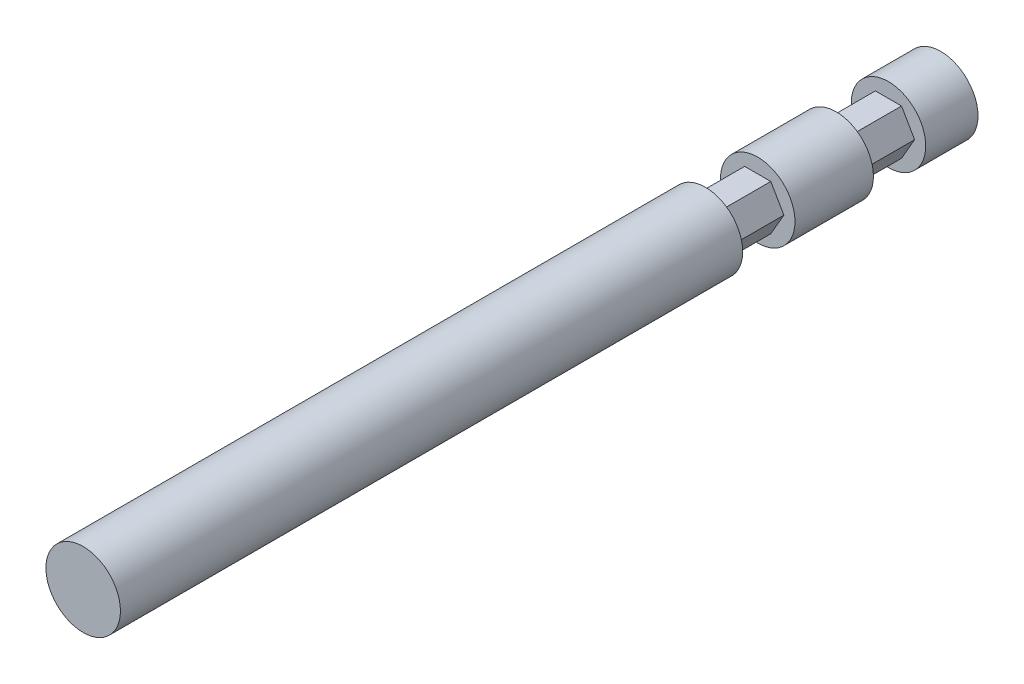
ISO-10303-21;
HEADER;
FILE_DESCRIPTION(('STEP AP214'),'2;1');
FILE_NAME('part.step','',(''),(''),'','','');
FILE_SCHEMA(('AUTOMOTIVE_DESIGN { 1 0 10303 214 1 1 1 1 }'));
ENDSEC;
DATA;
#1=APPLICATION_CONTEXT('core data for automotive mechanical design processes');
#2=APPLICATION_PROTOCOL_DEFINITION('international standard','automotive_design',2000,#1);
#3=PRODUCT_CONTEXT('',#1,'mechanical');
#4=PRODUCT('Part','Part','',(#3));
#5=PRODUCT_RELATED_PRODUCT_CATEGORY('part','',(#4));
#6=PRODUCT_DEFINITION_FORMATION('','',#4);
#7=PRODUCT_DEFINITION_CONTEXT('part definition',#1,'design');
#8=PRODUCT_DEFINITION('design','',#6,#7);
#9=PRODUCT_DEFINITION_SHAPE('','',#8);
#10=(LENGTH_UNIT() NAMED_UNIT(*) SI_UNIT(.MILLI.,.METRE.));
#11=(NAMED_UNIT(*) PLANE_ANGLE_UNIT() SI_UNIT($,.RADIAN.));
#12=(NAMED_UNIT(*) SI_UNIT($,.STERADIAN.) SOLID_ANGLE_UNIT());
#13=UNCERTAINTY_MEASURE_WITH_UNIT(LENGTH_MEASURE(1.E-05),#10,'distance_accuracy_value','');
#14=(GEOMETRIC_REPRESENTATION_CONTEXT(3) GLOBAL_UNCERTAINTY_ASSIGNED_CONTEXT((#13)) GLOBAL_UNIT_ASSIGNED_CONTEXT((#10,
#11,#12)) REPRESENTATION_CONTEXT('',''));
#15=CARTESIAN_POINT('',(0.,0.,0.));
#16=DIRECTION('',(0.,0.,1.));
#17=DIRECTION('',(1.,0.,0.));
#18=AXIS2_PLACEMENT_3D('',#15,#16,#17);
#19=CARTESIAN_POINT('',(0.,0.,4.));
#20=DIRECTION('',(0.,0.,-1.));
#21=DIRECTION('',(-1.,0.,0.));
#22=AXIS2_PLACEMENT_3D('',#19,#20,#21);
#23=CYLINDRICAL_SURFACE('',#22,2.85);
#24=CARTESIAN_POINT('',(0.,0.,4.));
#25=DIRECTION('',(0.,0.,1.));
#26=DIRECTION('',(1.,0.,0.));
#27=AXIS2_PLACEMENT_3D('',#24,#25,#26);
#28=CIRCLE('',#27,2.85);
#29=CARTESIAN_POINT('',(2.85,0.,4.));
#30=VERTEX_POINT('',#29);
#31=EDGE_CURVE('E11',#30,#30,#28,.T.);
#32=ORIENTED_EDGE('',*,*,#31,.F.);
#33=EDGE_LOOP('',(#32));
#34=FACE_BOUND('',#33,.T.);
#35=CARTESIAN_POINT('',(0.,0.,0.));
#36=DIRECTION('',(0.,0.,1.));
#37=DIRECTION('',(1.,0.,0.));
#38=AXIS2_PLACEMENT_3D('',#35,#36,#37);
#39=CIRCLE('',#38,2.85);
#40=CARTESIAN_POINT('',(2.85,0.,0.));
#41=VERTEX_POINT('',#40);
#42=EDGE_CURVE('E42',#41,#41,#39,.T.);
#43=ORIENTED_EDGE('',*,*,#42,.T.);
#44=EDGE_LOOP('',(#43));
#45=FACE_BOUND('',#44,.T.);
#46=ADVANCED_FACE('F39',(#34,#45),#23,.T.);
#47=CARTESIAN_POINT('',(0.,0.,4.));
#48=DIRECTION('',(0.,0.,1.));
#49=DIRECTION('',(1.,0.,0.));
#50=AXIS2_PLACEMENT_3D('',#47,#48,#49);
#51=PLANE('',#50);
#52=DIRECTION('',(0.5,0.866025403784439,0.));
#53=VECTOR('',#52,1.);
#54=CARTESIAN_POINT('',(1.,-1.73205080756888,4.));
#55=LINE('',#54,#53);
#56=CARTESIAN_POINT('',(1.,-1.73205080756888,4.));
#57=VERTEX_POINT('',#56);
#58=CARTESIAN_POINT('',(2.,0.,4.));
#59=VERTEX_POINT('',#58);
#60=EDGE_CURVE('E200',#57,#59,#55,.T.);
#61=ORIENTED_EDGE('',*,*,#60,.F.);
#62=DIRECTION('',(1.,0.,0.));
#63=VECTOR('',#62,1.);
#64=CARTESIAN_POINT('',(-1.,-1.73205080756888,4.));
#65=LINE('',#64,#63);
#66=CARTESIAN_POINT('',(-1.,-1.73205080756888,4.));
#67=VERTEX_POINT('',#66);
#68=EDGE_CURVE('E209',#67,#57,#65,.T.);
#69=ORIENTED_EDGE('',*,*,#68,.F.);
#70=DIRECTION('',(0.5,-0.866025403784439,0.));
#71=VECTOR('',#70,1.);
#72=CARTESIAN_POINT('',(-2.,0.,4.));
#73=LINE('',#72,#71);
#74=CARTESIAN_POINT('',(-2.,0.,4.));
#75=VERTEX_POINT('',#74);
#76=EDGE_CURVE('E245',#75,#67,#73,.T.);
#77=ORIENTED_EDGE('',*,*,#76,.F.);
#78=DIRECTION('',(-0.5,-0.866025403784439,0.));
#79=VECTOR('',#78,1.);
#80=CARTESIAN_POINT('',(-1.,1.73205080756888,4.));
#81=LINE('',#80,#79);
#82=CARTESIAN_POINT('',(-1.,1.73205080756888,4.));
#83=VERTEX_POINT('',#82);
#84=EDGE_CURVE('E241',#83,#75,#81,.T.);
#85=ORIENTED_EDGE('',*,*,#84,.F.);
#86=DIRECTION('',(-1.,0.,0.));
#87=VECTOR('',#86,1.);
#88=CARTESIAN_POINT('',(1.,1.73205080756888,4.));
#89=LINE('',#88,#87);
#90=CARTESIAN_POINT('',(1.,1.73205080756888,4.));
#91=VERTEX_POINT('',#90);
#92=EDGE_CURVE('E237',#91,#83,#89,.T.);
#93=ORIENTED_EDGE('',*,*,#92,.F.);
#94=DIRECTION('',(-0.5,0.866025403784439,0.));
#95=VECTOR('',#94,1.);
#96=CARTESIAN_POINT('',(2.,0.,4.));
#97=LINE('',#96,#95);
#98=EDGE_CURVE('E233',#59,#91,#97,.T.);
#99=ORIENTED_EDGE('',*,*,#98,.F.);
#100=EDGE_LOOP('',(#61,#69,#77,#85,#93,#99));
#101=FACE_BOUND('',#100,.T.);
#102=ORIENTED_EDGE('',*,*,#31,.T.);
#103=EDGE_LOOP('',(#102));
#104=FACE_BOUND('',#103,.T.);
#105=ADVANCED_FACE('F284',(#101,#104),#51,.T.);
#106=CARTESIAN_POINT('',(0.,0.,0.));
#107=DIRECTION('',(0.,0.,1.));
#108=DIRECTION('',(1.,0.,0.));
#109=AXIS2_PLACEMENT_3D('',#106,#107,#108);
#110=PLANE('',#109);
#111=ORIENTED_EDGE('',*,*,#42,.F.);
#112=EDGE_LOOP('',(#111));
#113=FACE_BOUND('',#112,.T.);
#114=ADVANCED_FACE('F281',(#113),#110,.F.);
#115=CARTESIAN_POINT('',(1.,-1.73205080756888,8.));
#116=DIRECTION('',(-0.866025403784439,0.5,0.));
#117=DIRECTION('',(-0.5,-0.866025403784439,0.));
#118=AXIS2_PLACEMENT_3D('',#115,#116,#117);
#119=PLANE('',#118);
#120=ORIENTED_EDGE('',*,*,#60,.T.);
#121=DIRECTION('',(0.,0.,-1.));
#122=VECTOR('',#121,1.);
#123=CARTESIAN_POINT('',(2.,0.,8.));
#124=LINE('',#123,#122);
#125=CARTESIAN_POINT('',(2.,0.,8.));
#126=VERTEX_POINT('',#125);
#127=EDGE_CURVE('E271',#126,#59,#124,.T.);
#128=ORIENTED_EDGE('',*,*,#127,.F.);
#129=DIRECTION('',(0.5,0.866025403784439,0.));
#130=VECTOR('',#129,1.);
#131=CARTESIAN_POINT('',(1.,-1.73205080756888,8.));
#132=LINE('',#131,#130);
#133=CARTESIAN_POINT('',(1.,-1.73205080756888,8.));
#134=VERTEX_POINT('',#133);
#135=EDGE_CURVE('E204',#134,#126,#132,.T.);
#136=ORIENTED_EDGE('',*,*,#135,.F.);
#137=DIRECTION('',(0.,0.,-1.));
#138=VECTOR('',#137,1.);
#139=CARTESIAN_POINT('',(1.,-1.73205080756888,8.));
#140=LINE('',#139,#138);
#141=EDGE_CURVE('E229',#134,#57,#140,.T.);
#142=ORIENTED_EDGE('',*,*,#141,.T.);
#143=EDGE_LOOP('',(#120,#128,#136,#142));
#144=FACE_BOUND('',#143,.T.);
#145=ADVANCED_FACE('F283',(#144),#119,.F.);
#146=CARTESIAN_POINT('',(2.,0.,8.));
#147=DIRECTION('',(-0.866025403784439,-0.5,0.));
#148=DIRECTION('',(0.5,-0.866025403784439,0.));
#149=AXIS2_PLACEMENT_3D('',#146,#147,#148);
#150=PLANE('',#149);
#151=ORIENTED_EDGE('',*,*,#98,.T.);
#152=DIRECTION('',(0.,0.,-1.));
#153=VECTOR('',#152,1.);
#154=CARTESIAN_POINT('',(1.,1.73205080756888,8.));
#155=LINE('',#154,#153);
#156=CARTESIAN_POINT('',(1.,1.73205080756888,8.));
#157=VERTEX_POINT('',#156);
#158=EDGE_CURVE('E267',#157,#91,#155,.T.);
#159=ORIENTED_EDGE('',*,*,#158,.F.);
#160=DIRECTION('',(-0.5,0.866025403784439,0.));
#161=VECTOR('',#160,1.);
#162=CARTESIAN_POINT('',(2.,0.,8.));
#163=LINE('',#162,#161);
#164=EDGE_CURVE('E208',#126,#157,#163,.T.);
#165=ORIENTED_EDGE('',*,*,#164,.F.);
#166=ORIENTED_EDGE('',*,*,#127,.T.);
#167=EDGE_LOOP('',(#151,#159,#165,#166));
#168=FACE_BOUND('',#167,.T.);
#169=ADVANCED_FACE('F289',(#168),#150,.F.);
#170=CARTESIAN_POINT('',(1.,1.73205080756888,8.));
#171=DIRECTION('',(0.,-1.,0.));
#172=DIRECTION('',(1.,0.,0.));
#173=AXIS2_PLACEMENT_3D('',#170,#171,#172);
#174=PLANE('',#173);
#175=ORIENTED_EDGE('',*,*,#92,.T.);
#176=DIRECTION('',(0.,0.,-1.));
#177=VECTOR('',#176,1.);
#178=CARTESIAN_POINT('',(-1.,1.73205080756888,8.));
#179=LINE('',#178,#177);
#180=CARTESIAN_POINT('',(-1.,1.73205080756888,8.));
#181=VERTEX_POINT('',#180);
#182=EDGE_CURVE('E263',#181,#83,#179,.T.);
#183=ORIENTED_EDGE('',*,*,#182,.F.);
#184=DIRECTION('',(-1.,0.,0.));
#185=VECTOR('',#184,1.);
#186=CARTESIAN_POINT('',(1.,1.73205080756888,8.));
#187=LINE('',#186,#185);
#188=EDGE_CURVE('E213',#157,#181,#187,.T.);
#189=ORIENTED_EDGE('',*,*,#188,.F.);
#190=ORIENTED_EDGE('',*,*,#158,.T.);
#191=EDGE_LOOP('',(#175,#183,#189,#190));
#192=FACE_BOUND('',#191,.T.);
#193=ADVANCED_FACE('F321',(#192),#174,.F.);
#194=CARTESIAN_POINT('',(-1.,1.73205080756888,8.));
#195=DIRECTION('',(0.866025403784439,-0.5,0.));
#196=DIRECTION('',(0.5,0.866025403784439,0.));
#197=AXIS2_PLACEMENT_3D('',#194,#195,#196);
#198=PLANE('',#197);
#199=ORIENTED_EDGE('',*,*,#84,.T.);
#200=DIRECTION('',(0.,0.,-1.));
#201=VECTOR('',#200,1.);
#202=CARTESIAN_POINT('',(-2.,0.,8.));
#203=LINE('',#202,#201);
#204=CARTESIAN_POINT('',(-2.,0.,8.));
#205=VERTEX_POINT('',#204);
#206=EDGE_CURVE('E259',#205,#75,#203,.T.);
#207=ORIENTED_EDGE('',*,*,#206,.F.);
#208=DIRECTION('',(-0.5,-0.866025403784439,0.));
#209=VECTOR('',#208,1.);
#210=CARTESIAN_POINT('',(-1.,1.73205080756888,8.));
#211=LINE('',#210,#209);
#212=EDGE_CURVE('E217',#181,#205,#211,.T.);
#213=ORIENTED_EDGE('',*,*,#212,.F.);
#214=ORIENTED_EDGE('',*,*,#182,.T.);
#215=EDGE_LOOP('',(#199,#207,#213,#214));
#216=FACE_BOUND('',#215,.T.);
#217=ADVANCED_FACE('F330',(#216),#198,.F.);
#218=CARTESIAN_POINT('',(-2.,0.,8.));
#219=DIRECTION('',(0.866025403784439,0.5,0.));
#220=DIRECTION('',(-0.5,0.866025403784439,0.));
#221=AXIS2_PLACEMENT_3D('',#218,#219,#220);
#222=PLANE('',#221);
#223=ORIENTED_EDGE('',*,*,#76,.T.);
#224=DIRECTION('',(0.,0.,-1.));
#225=VECTOR('',#224,1.);
#226=CARTESIAN_POINT('',(-1.,-1.73205080756888,8.));
#227=LINE('',#226,#225);
#228=CARTESIAN_POINT('',(-1.,-1.73205080756888,8.));
#229=VERTEX_POINT('',#228);
#230=EDGE_CURVE('E255',#229,#67,#227,.T.);
#231=ORIENTED_EDGE('',*,*,#230,.F.);
#232=DIRECTION('',(0.5,-0.866025403784439,0.));
#233=VECTOR('',#232,1.);
#234=CARTESIAN_POINT('',(-2.,0.,8.));
#235=LINE('',#234,#233);
#236=EDGE_CURVE('E221',#205,#229,#235,.T.);
#237=ORIENTED_EDGE('',*,*,#236,.F.);
#238=ORIENTED_EDGE('',*,*,#206,.T.);
#239=EDGE_LOOP('',(#223,#231,#237,#238));
#240=FACE_BOUND('',#239,.T.);
#241=ADVANCED_FACE('F340',(#240),#222,.F.);
#242=CARTESIAN_POINT('',(-1.,-1.73205080756888,8.));
#243=DIRECTION('',(0.,1.,0.));
#244=DIRECTION('',(-1.,0.,0.));
#245=AXIS2_PLACEMENT_3D('',#242,#243,#244);
#246=PLANE('',#245);
#247=ORIENTED_EDGE('',*,*,#68,.T.);
#248=ORIENTED_EDGE('',*,*,#141,.F.);
#249=DIRECTION('',(1.,0.,0.));
#250=VECTOR('',#249,1.);
#251=CARTESIAN_POINT('',(-1.,-1.73205080756888,8.));
#252=LINE('',#251,#250);
#253=EDGE_CURVE('E225',#229,#134,#252,.T.);
#254=ORIENTED_EDGE('',*,*,#253,.F.);
#255=ORIENTED_EDGE('',*,*,#230,.T.);
#256=EDGE_LOOP('',(#247,#248,#254,#255));
#257=FACE_BOUND('',#256,.T.);
#258=ADVANCED_FACE('F350',(#257),#246,.F.);
#259=CARTESIAN_POINT('',(0.,0.,8.));
#260=DIRECTION('',(0.,0.,1.));
#261=DIRECTION('',(1.,0.,0.));
#262=AXIS2_PLACEMENT_3D('',#259,#260,#261);
#263=PLANE('',#262);
#264=CARTESIAN_POINT('',(0.,0.,8.));
#265=DIRECTION('',(0.,0.,1.));
#266=DIRECTION('',(1.,0.,0.));
#267=AXIS2_PLACEMENT_3D('',#264,#265,#266);
#268=CIRCLE('',#267,2.85);
#269=CARTESIAN_POINT('',(2.85,0.,8.));
#270=VERTEX_POINT('',#269);
#271=EDGE_CURVE('E195',#270,#270,#268,.T.);
#272=ORIENTED_EDGE('',*,*,#271,.F.);
#273=EDGE_LOOP('',(#272));
#274=FACE_BOUND('',#273,.T.);
#275=ORIENTED_EDGE('',*,*,#253,.T.);
#276=ORIENTED_EDGE('',*,*,#135,.T.);
#277=ORIENTED_EDGE('',*,*,#164,.T.);
#278=ORIENTED_EDGE('',*,*,#188,.T.);
#279=ORIENTED_EDGE('',*,*,#212,.T.);
#280=ORIENTED_EDGE('',*,*,#236,.T.);
#281=EDGE_LOOP('',(#275,#276,#277,#278,#279,#280));
#282=FACE_BOUND('',#281,.T.);
#283=ADVANCED_FACE('F360',(#274,#282),#263,.F.);
#284=CARTESIAN_POINT('',(0.,0.,14.));
#285=DIRECTION('',(0.,0.,-1.));
#286=DIRECTION('',(-1.,0.,0.));
#287=AXIS2_PLACEMENT_3D('',#284,#285,#286);
#288=CYLINDRICAL_SURFACE('',#287,2.85);
#289=CARTESIAN_POINT('',(0.,0.,14.));
#290=DIRECTION('',(0.,0.,1.));
#291=DIRECTION('',(1.,0.,0.));
#292=AXIS2_PLACEMENT_3D('',#289,#290,#291);
#293=CIRCLE('',#292,2.85);
#294=CARTESIAN_POINT('',(2.85,0.,14.));
#295=VERTEX_POINT('',#294);
#296=EDGE_CURVE('E196',#295,#295,#293,.T.);
#297=ORIENTED_EDGE('',*,*,#296,.F.);
#298=EDGE_LOOP('',(#297));
#299=FACE_BOUND('',#298,.T.);
#300=ORIENTED_EDGE('',*,*,#271,.T.);
#301=EDGE_LOOP('',(#300));
#302=FACE_BOUND('',#301,.T.);
#303=ADVANCED_FACE('F370',(#299,#302),#288,.T.);
#304=CARTESIAN_POINT('',(0.,0.,14.));
#305=DIRECTION('',(0.,0.,1.));
#306=DIRECTION('',(1.,0.,0.));
#307=AXIS2_PLACEMENT_3D('',#304,#305,#306);
#308=PLANE('',#307);
#309=DIRECTION('',(0.5,0.866025403784439,0.));
#310=VECTOR('',#309,1.);
#311=CARTESIAN_POINT('',(1.,-1.73205080756888,14.));
#312=LINE('',#311,#310);
#313=CARTESIAN_POINT('',(1.,-1.73205080756888,14.));
#314=VERTEX_POINT('',#313);
#315=CARTESIAN_POINT('',(2.,0.,14.));
#316=VERTEX_POINT('',#315);
#317=EDGE_CURVE('E54',#314,#316,#312,.T.);
#318=ORIENTED_EDGE('',*,*,#317,.F.);
#319=DIRECTION('',(1.,0.,0.));
#320=VECTOR('',#319,1.);
#321=CARTESIAN_POINT('',(-1.,-1.73205080756888,14.));
#322=LINE('',#321,#320);
#323=CARTESIAN_POINT('',(-1.,-1.73205080756888,14.));
#324=VERTEX_POINT('',#323);
#325=EDGE_CURVE('E58',#324,#314,#322,.T.);
#326=ORIENTED_EDGE('',*,*,#325,.F.);
#327=DIRECTION('',(0.5,-0.866025403784439,0.));
#328=VECTOR('',#327,1.);
#329=CARTESIAN_POINT('',(-2.,0.,14.));
#330=LINE('',#329,#328);
#331=CARTESIAN_POINT('',(-2.,0.,14.));
#332=VERTEX_POINT('',#331);
#333=EDGE_CURVE('E174',#332,#324,#330,.T.);
#334=ORIENTED_EDGE('',*,*,#333,.F.);
#335=DIRECTION('',(-0.5,-0.866025403784438,0.));
#336=VECTOR('',#335,1.);
#337=CARTESIAN_POINT('',(-0.999999999999999,1.73205080756888,14.));
#338=LINE('',#337,#336);
#339=CARTESIAN_POINT('',(-0.999999999999999,1.73205080756888,14.));
#340=VERTEX_POINT('',#339);
#341=EDGE_CURVE('E170',#340,#332,#338,.T.);
#342=ORIENTED_EDGE('',*,*,#341,.F.);
#343=DIRECTION('',(-1.,0.,0.));
#344=VECTOR('',#343,1.);
#345=CARTESIAN_POINT('',(1.,1.73205080756888,14.));
#346=LINE('',#345,#344);
#347=CARTESIAN_POINT('',(1.,1.73205080756888,14.));
#348=VERTEX_POINT('',#347);
#349=EDGE_CURVE('E166',#348,#340,#346,.T.);
#350=ORIENTED_EDGE('',*,*,#349,.F.);
#351=DIRECTION('',(-0.5,0.866025403784439,0.));
#352=VECTOR('',#351,1.);
#353=CARTESIAN_POINT('',(2.,0.,14.));
#354=LINE('',#353,#352);
#355=EDGE_CURVE('E161',#316,#348,#354,.T.);
#356=ORIENTED_EDGE('',*,*,#355,.F.);
#357=EDGE_LOOP('',(#318,#326,#334,#342,#350,#356));
#358=FACE_BOUND('',#357,.T.);
#359=ORIENTED_EDGE('',*,*,#296,.T.);
#360=EDGE_LOOP('',(#359));
#361=FACE_BOUND('',#360,.T.);
#362=ADVANCED_FACE('F380',(#358,#361),#308,.T.);
#363=CARTESIAN_POINT('',(1.,-1.73205080756888,18.));
#364=DIRECTION('',(-0.866025403784439,0.5,0.));
#365=DIRECTION('',(-0.5,-0.866025403784439,0.));
#366=AXIS2_PLACEMENT_3D('',#363,#364,#365);
#367=PLANE('',#366);
#368=ORIENTED_EDGE('',*,*,#317,.T.);
#369=DIRECTION('',(0.,0.,-1.));
#370=VECTOR('',#369,1.);
#371=CARTESIAN_POINT('',(2.,0.,18.));
#372=LINE('',#371,#370);
#373=CARTESIAN_POINT('',(2.,0.,18.));
#374=VERTEX_POINT('',#373);
#375=EDGE_CURVE('E132',#374,#316,#372,.T.);
#376=ORIENTED_EDGE('',*,*,#375,.F.);
#377=DIRECTION('',(0.5,0.866025403784439,0.));
#378=VECTOR('',#377,1.);
#379=CARTESIAN_POINT('',(1.,-1.73205080756888,18.));
#380=LINE('',#379,#378);
#381=CARTESIAN_POINT('',(1.,-1.73205080756888,18.));
#382=VERTEX_POINT('',#381);
#383=EDGE_CURVE('E127',#382,#374,#380,.T.);
#384=ORIENTED_EDGE('',*,*,#383,.F.);
#385=DIRECTION('',(0.,0.,-1.));
#386=VECTOR('',#385,1.);
#387=CARTESIAN_POINT('',(1.,-1.73205080756888,18.));
#388=LINE('',#387,#386);
#389=EDGE_CURVE('E130',#382,#314,#388,.T.);
#390=ORIENTED_EDGE('',*,*,#389,.T.);
#391=EDGE_LOOP('',(#368,#376,#384,#390));
#392=FACE_BOUND('',#391,.T.);
#393=ADVANCED_FACE('F129',(#392),#367,.F.);
#394=CARTESIAN_POINT('',(2.,0.,18.));
#395=DIRECTION('',(-0.866025403784439,-0.5,0.));
#396=DIRECTION('',(0.5,-0.866025403784439,0.));
#397=AXIS2_PLACEMENT_3D('',#394,#395,#396);
#398=PLANE('',#397);
#399=ORIENTED_EDGE('',*,*,#355,.T.);
#400=DIRECTION('',(0.,0.,-1.));
#401=VECTOR('',#400,1.);
#402=CARTESIAN_POINT('',(1.,1.73205080756888,18.));
#403=LINE('',#402,#401);
#404=CARTESIAN_POINT('',(1.,1.73205080756888,18.));
#405=VERTEX_POINT('',#404);
#406=EDGE_CURVE('E189',#405,#348,#403,.T.);
#407=ORIENTED_EDGE('',*,*,#406,.F.);
#408=DIRECTION('',(-0.5,0.866025403784439,0.));
#409=VECTOR('',#408,1.);
#410=CARTESIAN_POINT('',(2.,0.,18.));
#411=LINE('',#410,#409);
#412=EDGE_CURVE('E137',#374,#405,#411,.T.);
#413=ORIENTED_EDGE('',*,*,#412,.F.);
#414=ORIENTED_EDGE('',*,*,#375,.T.);
#415=EDGE_LOOP('',(#399,#407,#413,#414));
#416=FACE_BOUND('',#415,.T.);
#417=ADVANCED_FACE('F398',(#416),#398,.F.);
#418=CARTESIAN_POINT('',(1.,1.73205080756888,18.));
#419=DIRECTION('',(0.,-1.,0.));
#420=DIRECTION('',(1.,0.,0.));
#421=AXIS2_PLACEMENT_3D('',#418,#419,#420);
#422=PLANE('',#421);
#423=ORIENTED_EDGE('',*,*,#349,.T.);
#424=DIRECTION('',(0.,0.,-1.));
#425=VECTOR('',#424,1.);
#426=CARTESIAN_POINT('',(-0.999999999999999,1.73205080756888,18.));
#427=LINE('',#426,#425);
#428=CARTESIAN_POINT('',(-0.999999999999999,1.73205080756888,18.));
#429=VERTEX_POINT('',#428);
#430=EDGE_CURVE('E185',#429,#340,#427,.T.);
#431=ORIENTED_EDGE('',*,*,#430,.F.);
#432=DIRECTION('',(-1.,0.,0.));
#433=VECTOR('',#432,1.);
#434=CARTESIAN_POINT('',(1.,1.73205080756888,18.));
#435=LINE('',#434,#433);
#436=EDGE_CURVE('E489',#405,#429,#435,.T.);
#437=ORIENTED_EDGE('',*,*,#436,.F.);
#438=ORIENTED_EDGE('',*,*,#406,.T.);
#439=EDGE_LOOP('',(#423,#431,#437,#438));
#440=FACE_BOUND('',#439,.T.);
#441=ADVANCED_FACE('F407',(#440),#422,.F.);
#442=CARTESIAN_POINT('',(-0.999999999999999,1.73205080756888,18.));
#443=DIRECTION('',(0.866025403784439,-0.5,0.));
#444=DIRECTION('',(0.5,0.866025403784438,0.));
#445=AXIS2_PLACEMENT_3D('',#442,#443,#444);
#446=PLANE('',#445);
#447=ORIENTED_EDGE('',*,*,#341,.T.);
#448=DIRECTION('',(0.,0.,-1.));
#449=VECTOR('',#448,1.);
#450=CARTESIAN_POINT('',(-2.,0.,18.));
#451=LINE('',#450,#449);
#452=CARTESIAN_POINT('',(-2.,0.,18.));
#453=VERTEX_POINT('',#452);
#454=EDGE_CURVE('E181',#453,#332,#451,.T.);
#455=ORIENTED_EDGE('',*,*,#454,.F.);
#456=DIRECTION('',(-0.5,-0.866025403784438,0.));
#457=VECTOR('',#456,1.);
#458=CARTESIAN_POINT('',(-0.999999999999999,1.73205080756888,18.));
#459=LINE('',#458,#457);
#460=EDGE_CURVE('E155',#429,#453,#459,.T.);
#461=ORIENTED_EDGE('',*,*,#460,.F.);
#462=ORIENTED_EDGE('',*,*,#430,.T.);
#463=EDGE_LOOP('',(#447,#455,#461,#462));
#464=FACE_BOUND('',#463,.T.);
#465=ADVANCED_FACE('F417',(#464),#446,.F.);
#466=CARTESIAN_POINT('',(-2.,0.,18.));
#467=DIRECTION('',(0.866025403784439,0.5,0.));
#468=DIRECTION('',(-0.5,0.866025403784439,0.));
#469=AXIS2_PLACEMENT_3D('',#466,#467,#468);
#470=PLANE('',#469);
#471=ORIENTED_EDGE('',*,*,#333,.T.);
#472=DIRECTION('',(0.,0.,-1.));
#473=VECTOR('',#472,1.);
#474=CARTESIAN_POINT('',(-1.,-1.73205080756888,18.));
#475=LINE('',#474,#473);
#476=CARTESIAN_POINT('',(-1.,-1.73205080756888,18.));
#477=VERTEX_POINT('',#476);
#478=EDGE_CURVE('E146',#477,#324,#475,.T.);
#479=ORIENTED_EDGE('',*,*,#478,.F.);
#480=DIRECTION('',(0.5,-0.866025403784439,0.));
#481=VECTOR('',#480,1.);
#482=CARTESIAN_POINT('',(-2.,0.,18.));
#483=LINE('',#482,#481);
#484=EDGE_CURVE('E151',#453,#477,#483,.T.);
#485=ORIENTED_EDGE('',*,*,#484,.F.);
#486=ORIENTED_EDGE('',*,*,#454,.T.);
#487=EDGE_LOOP('',(#471,#479,#485,#486));
#488=FACE_BOUND('',#487,.T.);
#489=ADVANCED_FACE('F427',(#488),#470,.F.);
#490=CARTESIAN_POINT('',(-1.,-1.73205080756888,18.));
#491=DIRECTION('',(0.,1.,0.));
#492=DIRECTION('',(-1.,0.,0.));
#493=AXIS2_PLACEMENT_3D('',#490,#491,#492);
#494=PLANE('',#493);
#495=ORIENTED_EDGE('',*,*,#325,.T.);
#496=ORIENTED_EDGE('',*,*,#389,.F.);
#497=DIRECTION('',(1.,0.,0.));
#498=VECTOR('',#497,1.);
#499=CARTESIAN_POINT('',(-1.,-1.73205080756888,18.));
#500=LINE('',#499,#498);
#501=EDGE_CURVE('E143',#477,#382,#500,.T.);
#502=ORIENTED_EDGE('',*,*,#501,.F.);
#503=ORIENTED_EDGE('',*,*,#478,.T.);
#504=EDGE_LOOP('',(#495,#496,#502,#503));
#505=FACE_BOUND('',#504,.T.);
#506=ADVANCED_FACE('F141',(#505),#494,.F.);
#507=CARTESIAN_POINT('',(0.,0.,18.));
#508=DIRECTION('',(0.,0.,1.));
#509=DIRECTION('',(1.,0.,0.));
#510=AXIS2_PLACEMENT_3D('',#507,#508,#509);
#511=PLANE('',#510);
#512=CARTESIAN_POINT('',(0.,0.,18.));
#513=DIRECTION('',(0.,0.,1.));
#514=DIRECTION('',(1.,0.,0.));
#515=AXIS2_PLACEMENT_3D('',#512,#513,#514);
#516=CIRCLE('',#515,2.85);
#517=CARTESIAN_POINT('',(2.85,0.,18.));
#518=VERTEX_POINT('',#517);
#519=EDGE_CURVE('E481',#518,#518,#516,.T.);
#520=ORIENTED_EDGE('',*,*,#519,.F.);
#521=EDGE_LOOP('',(#520));
#522=FACE_BOUND('',#521,.T.);
#523=ORIENTED_EDGE('',*,*,#501,.T.);
#524=ORIENTED_EDGE('',*,*,#383,.T.);
#525=ORIENTED_EDGE('',*,*,#412,.T.);
#526=ORIENTED_EDGE('',*,*,#436,.T.);
#527=ORIENTED_EDGE('',*,*,#460,.T.);
#528=ORIENTED_EDGE('',*,*,#484,.T.);
#529=EDGE_LOOP('',(#523,#524,#525,#526,#527,#528));
#530=FACE_BOUND('',#529,.T.);
#531=ADVANCED_FACE('F148',(#522,#530),#511,.F.);
#532=CARTESIAN_POINT('',(0.,0.,65.6));
#533=DIRECTION('',(0.,0.,-1.));
#534=DIRECTION('',(-1.,0.,0.));
#535=AXIS2_PLACEMENT_3D('',#532,#533,#534);
#536=CYLINDRICAL_SURFACE('',#535,2.85);
#537=CARTESIAN_POINT('',(0.,0.,65.6));
#538=DIRECTION('',(0.,0.,1.));
#539=DIRECTION('',(1.,0.,0.));
#540=AXIS2_PLACEMENT_3D('',#537,#538,#539);
#541=CIRCLE('',#540,2.85);
#542=CARTESIAN_POINT('',(2.85,0.,65.6));
#543=VERTEX_POINT('',#542);
#544=EDGE_CURVE('E162',#543,#543,#541,.T.);
#545=ORIENTED_EDGE('',*,*,#544,.F.);
#546=EDGE_LOOP('',(#545));
#547=FACE_BOUND('',#546,.T.);
#548=ORIENTED_EDGE('',*,*,#519,.T.);
#549=EDGE_LOOP('',(#548));
#550=FACE_BOUND('',#549,.T.);
#551=ADVANCED_FACE('F454',(#547,#550),#536,.T.);
#552=CARTESIAN_POINT('',(0.,0.,65.6));
#553=DIRECTION('',(0.,0.,1.));
#554=DIRECTION('',(1.,0.,0.));
#555=AXIS2_PLACEMENT_3D('',#552,#553,#554);
#556=PLANE('',#555);
#557=ORIENTED_EDGE('',*,*,#544,.T.);
#558=EDGE_LOOP('',(#557));
#559=FACE_BOUND('',#558,.T.);
#560=ADVANCED_FACE('F464',(#559),#556,.T.);
#561=CLOSED_SHELL('',(#46,#105,#114,#145,#169,#193,#217,#241,#258,#283,#303,#362,#393,#417,#441,
#465,#489,#506,#531,#551,#560));
#562=MANIFOLD_SOLID_BREP('B2',#561);
#563=ADVANCED_BREP_SHAPE_REPRESENTATION('',(#18,#562),#14);
#564=SHAPE_DEFINITION_REPRESENTATION(#9,#563);
ENDSEC;
END-ISO-10303-21;
